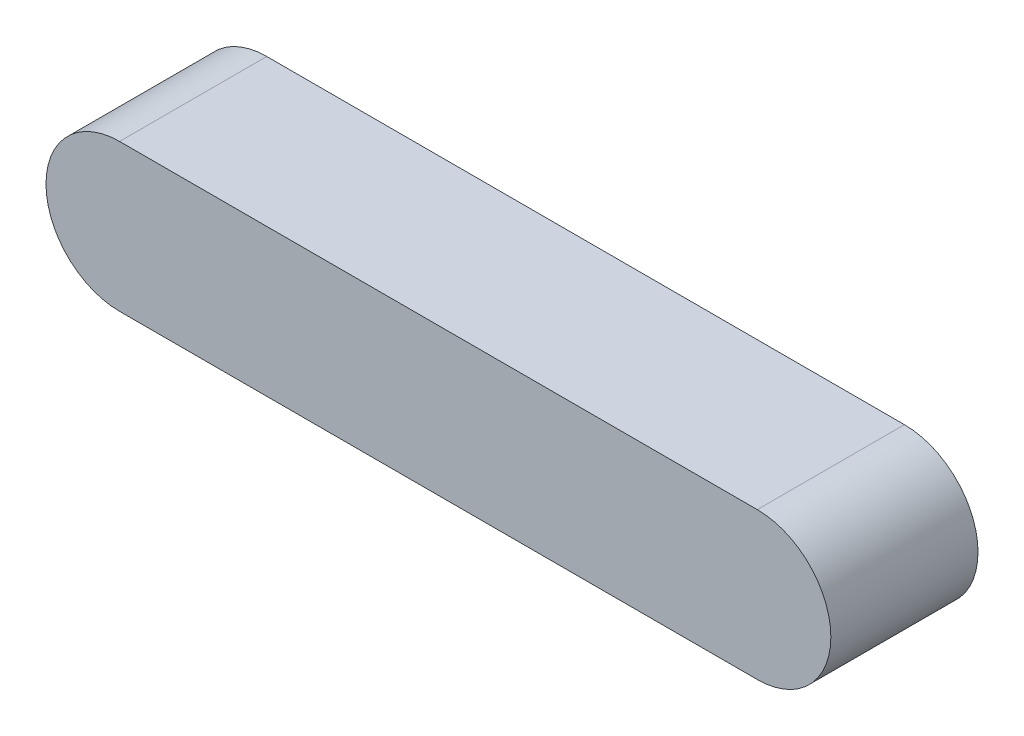
ISO-10303-21;
HEADER;
FILE_DESCRIPTION(('STEP AP214'),'2;1');
FILE_NAME('part.step','',(''),(''),'','','');
FILE_SCHEMA(('AUTOMOTIVE_DESIGN { 1 0 10303 214 1 1 1 1 }'));
ENDSEC;
DATA;
#1=APPLICATION_CONTEXT('core data for automotive mechanical design processes');
#2=APPLICATION_PROTOCOL_DEFINITION('international standard','automotive_design',2000,#1);
#3=PRODUCT_CONTEXT('',#1,'mechanical');
#4=PRODUCT('Part','Part','',(#3));
#5=PRODUCT_RELATED_PRODUCT_CATEGORY('part','',(#4));
#6=PRODUCT_DEFINITION_FORMATION('','',#4);
#7=PRODUCT_DEFINITION_CONTEXT('part definition',#1,'design');
#8=PRODUCT_DEFINITION('design','',#6,#7);
#9=PRODUCT_DEFINITION_SHAPE('','',#8);
#10=(LENGTH_UNIT() NAMED_UNIT(*) SI_UNIT(.MILLI.,.METRE.));
#11=(NAMED_UNIT(*) PLANE_ANGLE_UNIT() SI_UNIT($,.RADIAN.));
#12=(NAMED_UNIT(*) SI_UNIT($,.STERADIAN.) SOLID_ANGLE_UNIT());
#13=UNCERTAINTY_MEASURE_WITH_UNIT(LENGTH_MEASURE(1.E-05),#10,'distance_accuracy_value','');
#14=(GEOMETRIC_REPRESENTATION_CONTEXT(3) GLOBAL_UNCERTAINTY_ASSIGNED_CONTEXT((#13)) GLOBAL_UNIT_ASSIGNED_CONTEXT((#10,
#11,#12)) REPRESENTATION_CONTEXT('',''));
#15=CARTESIAN_POINT('',(0.,0.,0.));
#16=DIRECTION('',(0.,0.,1.));
#17=DIRECTION('',(1.,0.,0.));
#18=AXIS2_PLACEMENT_3D('',#15,#16,#17);
#19=CARTESIAN_POINT('',(0.,-3.,6.));
#20=DIRECTION('',(0.,0.,-1.));
#21=DIRECTION('',(-1.,0.,0.));
#22=AXIS2_PLACEMENT_3D('',#19,#20,#21);
#23=CYLINDRICAL_SURFACE('',#22,3.);
#24=CARTESIAN_POINT('',(0.,-3.,0.));
#25=DIRECTION('',(0.,0.,1.));
#26=DIRECTION('',(-1.,0.,0.));
#27=AXIS2_PLACEMENT_3D('',#24,#25,#26);
#28=CIRCLE('',#27,3.);
#29=CARTESIAN_POINT('',(0.,0.,0.));
#30=VERTEX_POINT('',#29);
#31=CARTESIAN_POINT('',(0.,-6.,0.));
#32=VERTEX_POINT('',#31);
#33=EDGE_CURVE('E76',#30,#32,#28,.T.);
#34=ORIENTED_EDGE('',*,*,#33,.T.);
#35=DIRECTION('',(0.,0.,-1.));
#36=VECTOR('',#35,1.);
#37=CARTESIAN_POINT('',(0.,-6.,6.));
#38=LINE('',#37,#36);
#39=CARTESIAN_POINT('',(0.,-6.,6.));
#40=VERTEX_POINT('',#39);
#41=EDGE_CURVE('E11',#40,#32,#38,.T.);
#42=ORIENTED_EDGE('',*,*,#41,.F.);
#43=CARTESIAN_POINT('',(0.,-3.,6.));
#44=DIRECTION('',(0.,0.,1.));
#45=DIRECTION('',(-1.,0.,0.));
#46=AXIS2_PLACEMENT_3D('',#43,#44,#45);
#47=CIRCLE('',#46,3.);
#48=CARTESIAN_POINT('',(0.,0.,6.));
#49=VERTEX_POINT('',#48);
#50=EDGE_CURVE('E94',#49,#40,#47,.T.);
#51=ORIENTED_EDGE('',*,*,#50,.F.);
#52=DIRECTION('',(0.,0.,-1.));
#53=VECTOR('',#52,1.);
#54=CARTESIAN_POINT('',(0.,0.,6.));
#55=LINE('',#54,#53);
#56=EDGE_CURVE('E88',#49,#30,#55,.T.);
#57=ORIENTED_EDGE('',*,*,#56,.T.);
#58=EDGE_LOOP('',(#34,#42,#51,#57));
#59=FACE_BOUND('',#58,.T.);
#60=ADVANCED_FACE('F32',(#59),#23,.T.);
#61=CARTESIAN_POINT('',(26.,-6.,6.));
#62=DIRECTION('',(0.,1.,0.));
#63=DIRECTION('',(-1.,0.,0.));
#64=AXIS2_PLACEMENT_3D('',#61,#62,#63);
#65=PLANE('',#64);
#66=DIRECTION('',(1.,0.,0.));
#67=VECTOR('',#66,1.);
#68=CARTESIAN_POINT('',(26.,-6.,0.));
#69=LINE('',#68,#67);
#70=CARTESIAN_POINT('',(26.,-6.,0.));
#71=VERTEX_POINT('',#70);
#72=EDGE_CURVE('E72',#32,#71,#69,.T.);
#73=ORIENTED_EDGE('',*,*,#72,.T.);
#74=DIRECTION('',(0.,0.,-1.));
#75=VECTOR('',#74,1.);
#76=CARTESIAN_POINT('',(26.,-6.,6.));
#77=LINE('',#76,#75);
#78=CARTESIAN_POINT('',(26.,-6.,6.));
#79=VERTEX_POINT('',#78);
#80=EDGE_CURVE('E39',#79,#71,#77,.T.);
#81=ORIENTED_EDGE('',*,*,#80,.F.);
#82=DIRECTION('',(1.,0.,0.));
#83=VECTOR('',#82,1.);
#84=CARTESIAN_POINT('',(26.,-6.,6.));
#85=LINE('',#84,#83);
#86=EDGE_CURVE('E84',#40,#79,#85,.T.);
#87=ORIENTED_EDGE('',*,*,#86,.F.);
#88=ORIENTED_EDGE('',*,*,#41,.T.);
#89=EDGE_LOOP('',(#73,#81,#87,#88));
#90=FACE_BOUND('',#89,.T.);
#91=ADVANCED_FACE('F83',(#90),#65,.F.);
#92=CARTESIAN_POINT('',(26.,-3.,6.));
#93=DIRECTION('',(0.,0.,-1.));
#94=DIRECTION('',(-1.,0.,0.));
#95=AXIS2_PLACEMENT_3D('',#92,#93,#94);
#96=CYLINDRICAL_SURFACE('',#95,3.);
#97=CARTESIAN_POINT('',(26.,-3.,0.));
#98=DIRECTION('',(0.,0.,1.));
#99=DIRECTION('',(-1.,0.,0.));
#100=AXIS2_PLACEMENT_3D('',#97,#98,#99);
#101=CIRCLE('',#100,3.);
#102=CARTESIAN_POINT('',(26.,0.,0.));
#103=VERTEX_POINT('',#102);
#104=EDGE_CURVE('E77',#71,#103,#101,.T.);
#105=ORIENTED_EDGE('',*,*,#104,.T.);
#106=DIRECTION('',(0.,0.,-1.));
#107=VECTOR('',#106,1.);
#108=CARTESIAN_POINT('',(26.,0.,6.));
#109=LINE('',#108,#107);
#110=CARTESIAN_POINT('',(26.,0.,6.));
#111=VERTEX_POINT('',#110);
#112=EDGE_CURVE('E100',#111,#103,#109,.T.);
#113=ORIENTED_EDGE('',*,*,#112,.F.);
#114=CARTESIAN_POINT('',(26.,-3.,6.));
#115=DIRECTION('',(0.,0.,1.));
#116=DIRECTION('',(-1.,0.,0.));
#117=AXIS2_PLACEMENT_3D('',#114,#115,#116);
#118=CIRCLE('',#117,3.);
#119=EDGE_CURVE('E51',#79,#111,#118,.T.);
#120=ORIENTED_EDGE('',*,*,#119,.F.);
#121=ORIENTED_EDGE('',*,*,#80,.T.);
#122=EDGE_LOOP('',(#105,#113,#120,#121));
#123=FACE_BOUND('',#122,.T.);
#124=ADVANCED_FACE('F103',(#123),#96,.T.);
#125=CARTESIAN_POINT('',(0.,0.,6.));
#126=DIRECTION('',(0.,-1.,0.));
#127=DIRECTION('',(0.,0.,-1.));
#128=AXIS2_PLACEMENT_3D('',#125,#126,#127);
#129=PLANE('',#128);
#130=DIRECTION('',(-1.,0.,0.));
#131=VECTOR('',#130,1.);
#132=CARTESIAN_POINT('',(0.,0.,0.));
#133=LINE('',#132,#131);
#134=EDGE_CURVE('E92',#103,#30,#133,.T.);
#135=ORIENTED_EDGE('',*,*,#134,.T.);
#136=ORIENTED_EDGE('',*,*,#56,.F.);
#137=DIRECTION('',(-1.,0.,0.));
#138=VECTOR('',#137,1.);
#139=CARTESIAN_POINT('',(0.,0.,6.));
#140=LINE('',#139,#138);
#141=EDGE_CURVE('E46',#111,#49,#140,.T.);
#142=ORIENTED_EDGE('',*,*,#141,.F.);
#143=ORIENTED_EDGE('',*,*,#112,.T.);
#144=EDGE_LOOP('',(#135,#136,#142,#143));
#145=FACE_BOUND('',#144,.T.);
#146=ADVANCED_FACE('F105',(#145),#129,.F.);
#147=CARTESIAN_POINT('',(0.,-3.,6.));
#148=DIRECTION('',(0.,0.,-1.));
#149=DIRECTION('',(-1.,0.,0.));
#150=AXIS2_PLACEMENT_3D('',#147,#148,#149);
#151=PLANE('',#150);
#152=ORIENTED_EDGE('',*,*,#50,.T.);
#153=ORIENTED_EDGE('',*,*,#86,.T.);
#154=ORIENTED_EDGE('',*,*,#119,.T.);
#155=ORIENTED_EDGE('',*,*,#141,.T.);
#156=EDGE_LOOP('',(#152,#153,#154,#155));
#157=FACE_BOUND('',#156,.T.);
#158=ADVANCED_FACE('F106',(#157),#151,.F.);
#159=CARTESIAN_POINT('',(0.,-3.,0.));
#160=DIRECTION('',(0.,0.,-1.));
#161=DIRECTION('',(-1.,0.,0.));
#162=AXIS2_PLACEMENT_3D('',#159,#160,#161);
#163=PLANE('',#162);
#164=ORIENTED_EDGE('',*,*,#33,.F.);
#165=ORIENTED_EDGE('',*,*,#134,.F.);
#166=ORIENTED_EDGE('',*,*,#104,.F.);
#167=ORIENTED_EDGE('',*,*,#72,.F.);
#168=EDGE_LOOP('',(#164,#165,#166,#167));
#169=FACE_BOUND('',#168,.T.);
#170=ADVANCED_FACE('F73',(#169),#163,.T.);
#171=CLOSED_SHELL('',(#60,#91,#124,#146,#158,#170));
#172=MANIFOLD_SOLID_BREP('B2',#171);
#173=ADVANCED_BREP_SHAPE_REPRESENTATION('',(#18,#172),#14);
#174=SHAPE_DEFINITION_REPRESENTATION(#9,#173);
ENDSEC;
END-ISO-10303-21;
